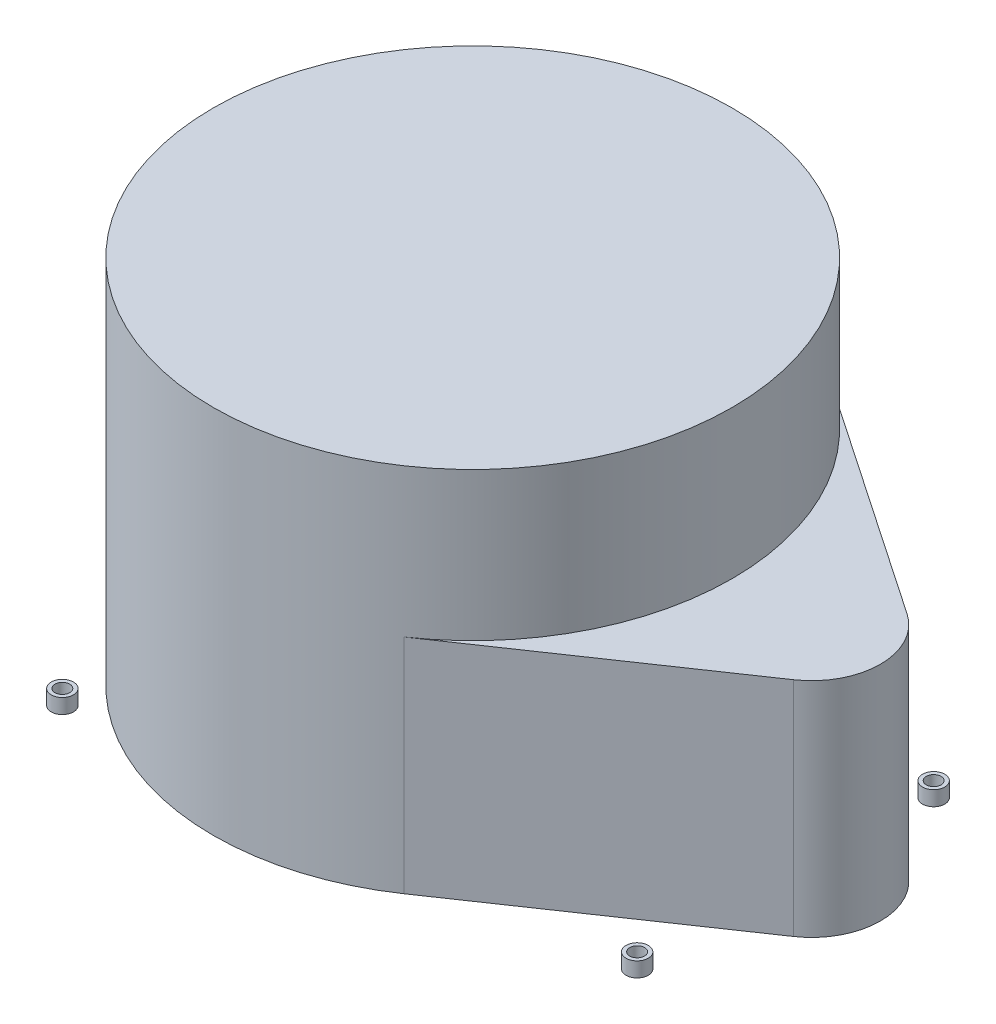
ISO-10303-21;
HEADER;
FILE_DESCRIPTION(('STEP AP214'),'2;1');
FILE_NAME('part.step','',(''),(''),'','','');
FILE_SCHEMA(('AUTOMOTIVE_DESIGN { 1 0 10303 214 1 1 1 1 }'));
ENDSEC;
DATA;
#1=APPLICATION_CONTEXT('core data for automotive mechanical design processes');
#2=APPLICATION_PROTOCOL_DEFINITION('international standard','automotive_design',2000,#1);
#3=PRODUCT_CONTEXT('',#1,'mechanical');
#4=PRODUCT('Part','Part','',(#3));
#5=PRODUCT_RELATED_PRODUCT_CATEGORY('part','',(#4));
#6=PRODUCT_DEFINITION_FORMATION('','',#4);
#7=PRODUCT_DEFINITION_CONTEXT('part definition',#1,'design');
#8=PRODUCT_DEFINITION('design','',#6,#7);
#9=PRODUCT_DEFINITION_SHAPE('','',#8);
#10=(LENGTH_UNIT() NAMED_UNIT(*) SI_UNIT(.MILLI.,.METRE.));
#11=(NAMED_UNIT(*) PLANE_ANGLE_UNIT() SI_UNIT($,.RADIAN.));
#12=(NAMED_UNIT(*) SI_UNIT($,.STERADIAN.) SOLID_ANGLE_UNIT());
#13=UNCERTAINTY_MEASURE_WITH_UNIT(LENGTH_MEASURE(1.E-05),#10,'distance_accuracy_value','');
#14=(GEOMETRIC_REPRESENTATION_CONTEXT(3) GLOBAL_UNCERTAINTY_ASSIGNED_CONTEXT((#13)) GLOBAL_UNIT_ASSIGNED_CONTEXT((#10,
#11,#12)) REPRESENTATION_CONTEXT('',''));
#15=CARTESIAN_POINT('',(0.,0.,0.));
#16=DIRECTION('',(0.,0.,1.));
#17=DIRECTION('',(1.,0.,0.));
#18=AXIS2_PLACEMENT_3D('',#15,#16,#17);
#19=CARTESIAN_POINT('',(-27.3582013614978,3.,-28.));
#20=DIRECTION('',(0.,-1.,0.));
#21=DIRECTION('',(0.,0.,-1.));
#22=AXIS2_PLACEMENT_3D('',#19,#20,#21);
#23=PLANE('',#22);
#24=CARTESIAN_POINT('',(-27.3582013614978,3.,-28.));
#25=DIRECTION('',(0.,-1.,0.));
#26=DIRECTION('',(0.,0.,-1.));
#27=AXIS2_PLACEMENT_3D('',#24,#25,#26);
#28=CIRCLE('',#27,1.5);
#29=CARTESIAN_POINT('',(-27.3582013614978,3.,-29.5));
#30=VERTEX_POINT('',#29);
#31=EDGE_CURVE('E11',#30,#30,#28,.T.);
#32=ORIENTED_EDGE('',*,*,#31,.T.);
#33=EDGE_LOOP('',(#32));
#34=FACE_BOUND('',#33,.T.);
#35=CARTESIAN_POINT('',(-27.3582013614978,3.,-28.));
#36=DIRECTION('',(0.,-1.,0.));
#37=DIRECTION('',(0.,0.,1.));
#38=AXIS2_PLACEMENT_3D('',#35,#36,#37);
#39=CIRCLE('',#38,1.);
#40=CARTESIAN_POINT('',(-27.3582013614978,3.,-27.));
#41=VERTEX_POINT('',#40);
#42=EDGE_CURVE('E53',#41,#41,#39,.T.);
#43=ORIENTED_EDGE('',*,*,#42,.F.);
#44=EDGE_LOOP('',(#43));
#45=FACE_BOUND('',#44,.T.);
#46=ADVANCED_FACE('F42',(#34,#45),#23,.T.);
#47=CARTESIAN_POINT('',(-27.3582013614978,5.,-28.));
#48=DIRECTION('',(0.,-1.,0.));
#49=DIRECTION('',(0.,0.,-1.));
#50=AXIS2_PLACEMENT_3D('',#47,#48,#49);
#51=PLANE('',#50);
#52=CARTESIAN_POINT('',(-27.3582013614978,5.,-28.));
#53=DIRECTION('',(0.,-1.,0.));
#54=DIRECTION('',(0.,0.,-1.));
#55=AXIS2_PLACEMENT_3D('',#52,#53,#54);
#56=CIRCLE('',#55,1.5);
#57=CARTESIAN_POINT('',(-27.3582013614978,5.,-29.5));
#58=VERTEX_POINT('',#57);
#59=EDGE_CURVE('E46',#58,#58,#56,.T.);
#60=ORIENTED_EDGE('',*,*,#59,.F.);
#61=EDGE_LOOP('',(#60));
#62=FACE_BOUND('',#61,.T.);
#63=CARTESIAN_POINT('',(-27.3582013614978,5.,-28.));
#64=DIRECTION('',(0.,-1.,0.));
#65=DIRECTION('',(0.,0.,1.));
#66=AXIS2_PLACEMENT_3D('',#63,#64,#65);
#67=CIRCLE('',#66,1.);
#68=CARTESIAN_POINT('',(-27.3582013614978,5.,-27.));
#69=VERTEX_POINT('',#68);
#70=EDGE_CURVE('E55',#69,#69,#67,.T.);
#71=ORIENTED_EDGE('',*,*,#70,.T.);
#72=EDGE_LOOP('',(#71));
#73=FACE_BOUND('',#72,.T.);
#74=ADVANCED_FACE('F65',(#62,#73),#51,.F.);
#75=CARTESIAN_POINT('',(-27.3582013614978,3.,-28.));
#76=DIRECTION('',(0.,1.,0.));
#77=DIRECTION('',(0.,0.,1.));
#78=AXIS2_PLACEMENT_3D('',#75,#76,#77);
#79=CYLINDRICAL_SURFACE('',#78,1.5);
#80=ORIENTED_EDGE('',*,*,#31,.F.);
#81=EDGE_LOOP('',(#80));
#82=FACE_BOUND('',#81,.T.);
#83=ORIENTED_EDGE('',*,*,#59,.T.);
#84=EDGE_LOOP('',(#83));
#85=FACE_BOUND('',#84,.T.);
#86=ADVANCED_FACE('F44',(#82,#85),#79,.T.);
#87=CARTESIAN_POINT('',(-27.3582013614978,3.,-28.));
#88=DIRECTION('',(0.,1.,0.));
#89=DIRECTION('',(0.,0.,1.));
#90=AXIS2_PLACEMENT_3D('',#87,#88,#89);
#91=CYLINDRICAL_SURFACE('',#90,1.);
#92=ORIENTED_EDGE('',*,*,#42,.T.);
#93=EDGE_LOOP('',(#92));
#94=FACE_BOUND('',#93,.T.);
#95=ORIENTED_EDGE('',*,*,#70,.F.);
#96=EDGE_LOOP('',(#95));
#97=FACE_BOUND('',#96,.T.);
#98=ADVANCED_FACE('F61',(#94,#97),#91,.F.);
#99=CLOSED_SHELL('',(#46,#74,#86,#98));
#100=MANIFOLD_SOLID_BREP('B2',#99);
#101=CARTESIAN_POINT('',(42.183153241357,3.,-20.));
#102=DIRECTION('',(0.,1.,0.));
#103=DIRECTION('',(0.,0.,1.));
#104=AXIS2_PLACEMENT_3D('',#101,#102,#103);
#105=PLANE('',#104);
#106=CARTESIAN_POINT('',(42.183153241357,3.,-20.));
#107=DIRECTION('',(0.,-1.,0.));
#108=DIRECTION('',(0.,0.,1.));
#109=AXIS2_PLACEMENT_3D('',#106,#107,#108);
#110=CIRCLE('',#109,1.5);
#111=CARTESIAN_POINT('',(42.183153241357,3.,-18.5));
#112=VERTEX_POINT('',#111);
#113=EDGE_CURVE('E41',#112,#112,#110,.T.);
#114=ORIENTED_EDGE('',*,*,#113,.T.);
#115=EDGE_LOOP('',(#114));
#116=FACE_BOUND('',#115,.T.);
#117=CARTESIAN_POINT('',(42.183153241357,3.,-20.));
#118=DIRECTION('',(0.,-1.,0.));
#119=DIRECTION('',(0.,0.,1.));
#120=AXIS2_PLACEMENT_3D('',#117,#118,#119);
#121=CIRCLE('',#120,0.999999999999998);
#122=CARTESIAN_POINT('',(42.183153241357,3.,-19.));
#123=VERTEX_POINT('',#122);
#124=EDGE_CURVE('E123',#123,#123,#121,.T.);
#125=ORIENTED_EDGE('',*,*,#124,.F.);
#126=EDGE_LOOP('',(#125));
#127=FACE_BOUND('',#126,.T.);
#128=ADVANCED_FACE('F112',(#116,#127),#105,.F.);
#129=CARTESIAN_POINT('',(42.183153241357,5.,-20.));
#130=DIRECTION('',(0.,1.,0.));
#131=DIRECTION('',(0.,0.,1.));
#132=AXIS2_PLACEMENT_3D('',#129,#130,#131);
#133=PLANE('',#132);
#134=CARTESIAN_POINT('',(42.183153241357,5.,-20.));
#135=DIRECTION('',(0.,-1.,0.));
#136=DIRECTION('',(0.,0.,1.));
#137=AXIS2_PLACEMENT_3D('',#134,#135,#136);
#138=CIRCLE('',#137,1.5);
#139=CARTESIAN_POINT('',(42.183153241357,5.,-18.5));
#140=VERTEX_POINT('',#139);
#141=EDGE_CURVE('E116',#140,#140,#138,.T.);
#142=ORIENTED_EDGE('',*,*,#141,.F.);
#143=EDGE_LOOP('',(#142));
#144=FACE_BOUND('',#143,.T.);
#145=CARTESIAN_POINT('',(42.183153241357,5.,-20.));
#146=DIRECTION('',(0.,-1.,0.));
#147=DIRECTION('',(0.,0.,1.));
#148=AXIS2_PLACEMENT_3D('',#145,#146,#147);
#149=CIRCLE('',#148,0.999999999999998);
#150=CARTESIAN_POINT('',(42.183153241357,5.,-19.));
#151=VERTEX_POINT('',#150);
#152=EDGE_CURVE('E125',#151,#151,#149,.T.);
#153=ORIENTED_EDGE('',*,*,#152,.T.);
#154=EDGE_LOOP('',(#153));
#155=FACE_BOUND('',#154,.T.);
#156=ADVANCED_FACE('F135',(#144,#155),#133,.T.);
#157=CARTESIAN_POINT('',(42.183153241357,3.,-20.));
#158=DIRECTION('',(0.,1.,0.));
#159=DIRECTION('',(0.,0.,1.));
#160=AXIS2_PLACEMENT_3D('',#157,#158,#159);
#161=CYLINDRICAL_SURFACE('',#160,1.5);
#162=ORIENTED_EDGE('',*,*,#113,.F.);
#163=EDGE_LOOP('',(#162));
#164=FACE_BOUND('',#163,.T.);
#165=ORIENTED_EDGE('',*,*,#141,.T.);
#166=EDGE_LOOP('',(#165));
#167=FACE_BOUND('',#166,.T.);
#168=ADVANCED_FACE('F114',(#164,#167),#161,.T.);
#169=CARTESIAN_POINT('',(42.183153241357,3.,-20.));
#170=DIRECTION('',(0.,1.,0.));
#171=DIRECTION('',(0.,0.,1.));
#172=AXIS2_PLACEMENT_3D('',#169,#170,#171);
#173=CYLINDRICAL_SURFACE('',#172,0.999999999999998);
#174=ORIENTED_EDGE('',*,*,#124,.T.);
#175=EDGE_LOOP('',(#174));
#176=FACE_BOUND('',#175,.T.);
#177=ORIENTED_EDGE('',*,*,#152,.F.);
#178=EDGE_LOOP('',(#177));
#179=FACE_BOUND('',#178,.T.);
#180=ADVANCED_FACE('F131',(#176,#179),#173,.F.);
#181=CLOSED_SHELL('',(#128,#156,#168,#180));
#182=MANIFOLD_SOLID_BREP('B6',#181);
#183=CARTESIAN_POINT('',(-27.3582013614978,3.,28.));
#184=DIRECTION('',(0.,-1.,0.));
#185=DIRECTION('',(0.,0.,-1.));
#186=AXIS2_PLACEMENT_3D('',#183,#184,#185);
#187=PLANE('',#186);
#188=CARTESIAN_POINT('',(-27.3582013614978,3.,28.));
#189=DIRECTION('',(0.,-1.,0.));
#190=DIRECTION('',(0.,0.,-1.));
#191=AXIS2_PLACEMENT_3D('',#188,#189,#190);
#192=CIRCLE('',#191,1.5);
#193=CARTESIAN_POINT('',(-27.3582013614978,3.,26.5));
#194=VERTEX_POINT('',#193);
#195=EDGE_CURVE('E111',#194,#194,#192,.T.);
#196=ORIENTED_EDGE('',*,*,#195,.T.);
#197=EDGE_LOOP('',(#196));
#198=FACE_BOUND('',#197,.T.);
#199=CARTESIAN_POINT('',(-27.3582013614978,3.,28.));
#200=DIRECTION('',(0.,-1.,0.));
#201=DIRECTION('',(0.,0.,-1.));
#202=AXIS2_PLACEMENT_3D('',#199,#200,#201);
#203=CIRCLE('',#202,1.);
#204=CARTESIAN_POINT('',(-27.3582013614978,3.,27.));
#205=VERTEX_POINT('',#204);
#206=EDGE_CURVE('E193',#205,#205,#203,.T.);
#207=ORIENTED_EDGE('',*,*,#206,.F.);
#208=EDGE_LOOP('',(#207));
#209=FACE_BOUND('',#208,.T.);
#210=ADVANCED_FACE('F182',(#198,#209),#187,.T.);
#211=CARTESIAN_POINT('',(-27.3582013614978,5.,28.));
#212=DIRECTION('',(0.,-1.,0.));
#213=DIRECTION('',(0.,0.,-1.));
#214=AXIS2_PLACEMENT_3D('',#211,#212,#213);
#215=PLANE('',#214);
#216=CARTESIAN_POINT('',(-27.3582013614978,5.,28.));
#217=DIRECTION('',(0.,-1.,0.));
#218=DIRECTION('',(0.,0.,-1.));
#219=AXIS2_PLACEMENT_3D('',#216,#217,#218);
#220=CIRCLE('',#219,1.5);
#221=CARTESIAN_POINT('',(-27.3582013614978,5.,26.5));
#222=VERTEX_POINT('',#221);
#223=EDGE_CURVE('E186',#222,#222,#220,.T.);
#224=ORIENTED_EDGE('',*,*,#223,.F.);
#225=EDGE_LOOP('',(#224));
#226=FACE_BOUND('',#225,.T.);
#227=CARTESIAN_POINT('',(-27.3582013614978,5.,28.));
#228=DIRECTION('',(0.,-1.,0.));
#229=DIRECTION('',(0.,0.,-1.));
#230=AXIS2_PLACEMENT_3D('',#227,#228,#229);
#231=CIRCLE('',#230,1.);
#232=CARTESIAN_POINT('',(-27.3582013614978,5.,27.));
#233=VERTEX_POINT('',#232);
#234=EDGE_CURVE('E195',#233,#233,#231,.T.);
#235=ORIENTED_EDGE('',*,*,#234,.T.);
#236=EDGE_LOOP('',(#235));
#237=FACE_BOUND('',#236,.T.);
#238=ADVANCED_FACE('F205',(#226,#237),#215,.F.);
#239=CARTESIAN_POINT('',(-27.3582013614978,3.,28.));
#240=DIRECTION('',(0.,1.,0.));
#241=DIRECTION('',(0.,0.,1.));
#242=AXIS2_PLACEMENT_3D('',#239,#240,#241);
#243=CYLINDRICAL_SURFACE('',#242,1.5);
#244=ORIENTED_EDGE('',*,*,#195,.F.);
#245=EDGE_LOOP('',(#244));
#246=FACE_BOUND('',#245,.T.);
#247=ORIENTED_EDGE('',*,*,#223,.T.);
#248=EDGE_LOOP('',(#247));
#249=FACE_BOUND('',#248,.T.);
#250=ADVANCED_FACE('F184',(#246,#249),#243,.T.);
#251=CARTESIAN_POINT('',(-27.3582013614978,3.,28.));
#252=DIRECTION('',(0.,1.,0.));
#253=DIRECTION('',(0.,0.,1.));
#254=AXIS2_PLACEMENT_3D('',#251,#252,#253);
#255=CYLINDRICAL_SURFACE('',#254,1.);
#256=ORIENTED_EDGE('',*,*,#206,.T.);
#257=EDGE_LOOP('',(#256));
#258=FACE_BOUND('',#257,.T.);
#259=ORIENTED_EDGE('',*,*,#234,.F.);
#260=EDGE_LOOP('',(#259));
#261=FACE_BOUND('',#260,.T.);
#262=ADVANCED_FACE('F201',(#258,#261),#255,.F.);
#263=CLOSED_SHELL('',(#210,#238,#250,#262));
#264=MANIFOLD_SOLID_BREP('B36',#263);
#265=CARTESIAN_POINT('',(42.183153241357,3.,20.));
#266=DIRECTION('',(0.,-1.,0.));
#267=DIRECTION('',(0.,0.,-1.));
#268=AXIS2_PLACEMENT_3D('',#265,#266,#267);
#269=PLANE('',#268);
#270=CARTESIAN_POINT('',(42.183153241357,3.,20.));
#271=DIRECTION('',(0.,-1.,0.));
#272=DIRECTION('',(0.,0.,-1.));
#273=AXIS2_PLACEMENT_3D('',#270,#271,#272);
#274=CIRCLE('',#273,1.5);
#275=CARTESIAN_POINT('',(42.183153241357,3.,18.5));
#276=VERTEX_POINT('',#275);
#277=EDGE_CURVE('E181',#276,#276,#274,.T.);
#278=ORIENTED_EDGE('',*,*,#277,.T.);
#279=EDGE_LOOP('',(#278));
#280=FACE_BOUND('',#279,.T.);
#281=CARTESIAN_POINT('',(42.183153241357,3.,20.));
#282=DIRECTION('',(0.,-1.,0.));
#283=DIRECTION('',(0.,0.,-1.));
#284=AXIS2_PLACEMENT_3D('',#281,#282,#283);
#285=CIRCLE('',#284,0.999999999999998);
#286=CARTESIAN_POINT('',(42.183153241357,3.,19.));
#287=VERTEX_POINT('',#286);
#288=EDGE_CURVE('E264',#287,#287,#285,.T.);
#289=ORIENTED_EDGE('',*,*,#288,.F.);
#290=EDGE_LOOP('',(#289));
#291=FACE_BOUND('',#290,.T.);
#292=ADVANCED_FACE('F253',(#280,#291),#269,.T.);
#293=CARTESIAN_POINT('',(42.183153241357,5.,20.));
#294=DIRECTION('',(0.,-1.,0.));
#295=DIRECTION('',(0.,0.,-1.));
#296=AXIS2_PLACEMENT_3D('',#293,#294,#295);
#297=PLANE('',#296);
#298=CARTESIAN_POINT('',(42.183153241357,5.,20.));
#299=DIRECTION('',(0.,-1.,0.));
#300=DIRECTION('',(0.,0.,-1.));
#301=AXIS2_PLACEMENT_3D('',#298,#299,#300);
#302=CIRCLE('',#301,1.5);
#303=CARTESIAN_POINT('',(42.183153241357,5.,18.5));
#304=VERTEX_POINT('',#303);
#305=EDGE_CURVE('E257',#304,#304,#302,.T.);
#306=ORIENTED_EDGE('',*,*,#305,.F.);
#307=EDGE_LOOP('',(#306));
#308=FACE_BOUND('',#307,.T.);
#309=CARTESIAN_POINT('',(42.183153241357,5.,20.));
#310=DIRECTION('',(0.,-1.,0.));
#311=DIRECTION('',(0.,0.,-1.));
#312=AXIS2_PLACEMENT_3D('',#309,#310,#311);
#313=CIRCLE('',#312,0.999999999999998);
#314=CARTESIAN_POINT('',(42.183153241357,5.,19.));
#315=VERTEX_POINT('',#314);
#316=EDGE_CURVE('E266',#315,#315,#313,.T.);
#317=ORIENTED_EDGE('',*,*,#316,.T.);
#318=EDGE_LOOP('',(#317));
#319=FACE_BOUND('',#318,.T.);
#320=ADVANCED_FACE('F276',(#308,#319),#297,.F.);
#321=CARTESIAN_POINT('',(42.183153241357,3.,20.));
#322=DIRECTION('',(0.,1.,0.));
#323=DIRECTION('',(0.,0.,1.));
#324=AXIS2_PLACEMENT_3D('',#321,#322,#323);
#325=CYLINDRICAL_SURFACE('',#324,1.5);
#326=ORIENTED_EDGE('',*,*,#277,.F.);
#327=EDGE_LOOP('',(#326));
#328=FACE_BOUND('',#327,.T.);
#329=ORIENTED_EDGE('',*,*,#305,.T.);
#330=EDGE_LOOP('',(#329));
#331=FACE_BOUND('',#330,.T.);
#332=ADVANCED_FACE('F255',(#328,#331),#325,.T.);
#333=CARTESIAN_POINT('',(42.183153241357,3.,20.));
#334=DIRECTION('',(0.,1.,0.));
#335=DIRECTION('',(0.,0.,1.));
#336=AXIS2_PLACEMENT_3D('',#333,#334,#335);
#337=CYLINDRICAL_SURFACE('',#336,0.999999999999998);
#338=ORIENTED_EDGE('',*,*,#288,.T.);
#339=EDGE_LOOP('',(#338));
#340=FACE_BOUND('',#339,.T.);
#341=ORIENTED_EDGE('',*,*,#316,.F.);
#342=EDGE_LOOP('',(#341));
#343=FACE_BOUND('',#342,.T.);
#344=ADVANCED_FACE('F272',(#340,#343),#337,.F.);
#345=CLOSED_SHELL('',(#292,#320,#332,#344));
#346=MANIFOLD_SOLID_BREP('B106',#345);
#347=CARTESIAN_POINT('',(0.,35.,0.));
#348=DIRECTION('',(0.,-1.,0.));
#349=DIRECTION('',(0.,0.,-1.));
#350=AXIS2_PLACEMENT_3D('',#347,#348,#349);
#351=CYLINDRICAL_SURFACE('',#350,35.);
#352=CARTESIAN_POINT('',(0.,5.,0.));
#353=DIRECTION('',(0.,1.,0.));
#354=DIRECTION('',(0.,0.,1.));
#355=AXIS2_PLACEMENT_3D('',#352,#353,#354);
#356=CIRCLE('',#355,35.);
#357=CARTESIAN_POINT('',(19.693574926227,5.,-28.9337710405174));
#358=VERTEX_POINT('',#357);
#359=CARTESIAN_POINT('',(19.693574926227,5.,28.9337710405174));
#360=VERTEX_POINT('',#359);
#361=EDGE_CURVE('E368',#358,#360,#356,.T.);
#362=ORIENTED_EDGE('',*,*,#361,.T.);
#363=DIRECTION('',(0.,-1.,0.));
#364=VECTOR('',#363,1.);
#365=CARTESIAN_POINT('',(19.693574926227,35.,28.9337710405174));
#366=LINE('',#365,#364);
#367=CARTESIAN_POINT('',(19.693574926227,35.,28.9337710405174));
#368=VERTEX_POINT('',#367);
#369=EDGE_CURVE('E251',#368,#360,#366,.T.);
#370=ORIENTED_EDGE('',*,*,#369,.F.);
#371=CARTESIAN_POINT('',(0.,35.,0.));
#372=DIRECTION('',(0.,1.,0.));
#373=DIRECTION('',(0.,0.,1.));
#374=AXIS2_PLACEMENT_3D('',#371,#372,#373);
#375=CIRCLE('',#374,35.);
#376=CARTESIAN_POINT('',(19.693574926227,35.,-28.9337710405174));
#377=VERTEX_POINT('',#376);
#378=EDGE_CURVE('E366',#368,#377,#375,.T.);
#379=ORIENTED_EDGE('',*,*,#378,.T.);
#380=DIRECTION('',(0.,-1.,0.));
#381=VECTOR('',#380,1.);
#382=CARTESIAN_POINT('',(19.693574926227,35.,-28.9337710405174));
#383=LINE('',#382,#381);
#384=EDGE_CURVE('E382',#377,#358,#383,.T.);
#385=ORIENTED_EDGE('',*,*,#384,.T.);
#386=EDGE_LOOP('',(#362,#370,#379,#385));
#387=FACE_BOUND('',#386,.T.);
#388=CARTESIAN_POINT('',(0.,55.,0.));
#389=DIRECTION('',(0.,1.,0.));
#390=DIRECTION('',(0.,0.,1.));
#391=AXIS2_PLACEMENT_3D('',#388,#389,#390);
#392=CIRCLE('',#391,35.);
#393=CARTESIAN_POINT('',(0.,55.,35.));
#394=VERTEX_POINT('',#393);
#395=EDGE_CURVE('E375',#394,#394,#392,.T.);
#396=ORIENTED_EDGE('',*,*,#395,.F.);
#397=EDGE_LOOP('',(#396));
#398=FACE_BOUND('',#397,.T.);
#399=ADVANCED_FACE('F315',(#387,#398),#351,.T.);
#400=CARTESIAN_POINT('',(50.9470463126424,35.,7.66130781437387));
#401=DIRECTION('',(-0.562673569320771,0.,-0.826679172586211));
#402=DIRECTION('',(-0.826679172586211,0.,0.562673569320771));
#403=AXIS2_PLACEMENT_3D('',#400,#401,#402);
#404=PLANE('',#403);
#405=DIRECTION('',(0.826679172586211,0.,-0.562673569320771));
#406=VECTOR('',#405,1.);
#407=CARTESIAN_POINT('',(50.9470463126424,5.,7.66130781437387));
#408=LINE('',#407,#406);
#409=CARTESIAN_POINT('',(50.9470463126424,5.,7.66130781437387));
#410=VERTEX_POINT('',#409);
#411=EDGE_CURVE('E384',#360,#410,#408,.T.);
#412=ORIENTED_EDGE('',*,*,#411,.T.);
#413=DIRECTION('',(0.,-1.,0.));
#414=VECTOR('',#413,1.);
#415=CARTESIAN_POINT('',(50.9470463126424,35.,7.66130781437387));
#416=LINE('',#415,#414);
#417=CARTESIAN_POINT('',(50.9470463126424,35.,7.66130781437387));
#418=VERTEX_POINT('',#417);
#419=EDGE_CURVE('E323',#418,#410,#416,.T.);
#420=ORIENTED_EDGE('',*,*,#419,.F.);
#421=DIRECTION('',(0.826679172586211,0.,-0.562673569320771));
#422=VECTOR('',#421,1.);
#423=CARTESIAN_POINT('',(50.9470463126424,35.,7.66130781437387));
#424=LINE('',#423,#422);
#425=EDGE_CURVE('E358',#368,#418,#424,.T.);
#426=ORIENTED_EDGE('',*,*,#425,.F.);
#427=ORIENTED_EDGE('',*,*,#369,.T.);
#428=EDGE_LOOP('',(#412,#420,#426,#427));
#429=FACE_BOUND('',#428,.T.);
#430=ADVANCED_FACE('F370',(#429),#404,.F.);
#431=CARTESIAN_POINT('',(45.7324291352279,35.,0.));
#432=DIRECTION('',(0.,-1.,0.));
#433=DIRECTION('',(0.,0.,-1.));
#434=AXIS2_PLACEMENT_3D('',#431,#432,#433);
#435=CYLINDRICAL_SURFACE('',#434,9.26757086477209);
#436=CARTESIAN_POINT('',(45.7324291352279,5.,0.));
#437=DIRECTION('',(0.,1.,0.));
#438=DIRECTION('',(0.,0.,1.));
#439=AXIS2_PLACEMENT_3D('',#436,#437,#438);
#440=CIRCLE('',#439,9.26757086477209);
#441=CARTESIAN_POINT('',(50.9470463126424,5.,-7.66130781437387));
#442=VERTEX_POINT('',#441);
#443=EDGE_CURVE('E349',#410,#442,#440,.T.);
#444=ORIENTED_EDGE('',*,*,#443,.T.);
#445=DIRECTION('',(0.,-1.,0.));
#446=VECTOR('',#445,1.);
#447=CARTESIAN_POINT('',(50.9470463126424,35.,-7.66130781437387));
#448=LINE('',#447,#446);
#449=CARTESIAN_POINT('',(50.9470463126424,35.,-7.66130781437387));
#450=VERTEX_POINT('',#449);
#451=EDGE_CURVE('E389',#450,#442,#448,.T.);
#452=ORIENTED_EDGE('',*,*,#451,.F.);
#453=CARTESIAN_POINT('',(45.7324291352279,35.,0.));
#454=DIRECTION('',(0.,1.,0.));
#455=DIRECTION('',(0.,0.,1.));
#456=AXIS2_PLACEMENT_3D('',#453,#454,#455);
#457=CIRCLE('',#456,9.26757086477209);
#458=EDGE_CURVE('E372',#418,#450,#457,.T.);
#459=ORIENTED_EDGE('',*,*,#458,.F.);
#460=ORIENTED_EDGE('',*,*,#419,.T.);
#461=EDGE_LOOP('',(#444,#452,#459,#460));
#462=FACE_BOUND('',#461,.T.);
#463=ADVANCED_FACE('F390',(#462),#435,.T.);
#464=CARTESIAN_POINT('',(19.693574926227,35.,-28.9337710405174));
#465=DIRECTION('',(-0.562673569320771,0.,0.826679172586211));
#466=DIRECTION('',(0.826679172586211,0.,0.562673569320771));
#467=AXIS2_PLACEMENT_3D('',#464,#465,#466);
#468=PLANE('',#467);
#469=DIRECTION('',(-0.826679172586212,0.,-0.562673569320771));
#470=VECTOR('',#469,1.);
#471=CARTESIAN_POINT('',(19.693574926227,5.,-28.9337710405174));
#472=LINE('',#471,#470);
#473=EDGE_CURVE('E354',#442,#358,#472,.T.);
#474=ORIENTED_EDGE('',*,*,#473,.T.);
#475=ORIENTED_EDGE('',*,*,#384,.F.);
#476=DIRECTION('',(-0.826679172586212,0.,-0.562673569320771));
#477=VECTOR('',#476,1.);
#478=CARTESIAN_POINT('',(19.693574926227,35.,-28.9337710405174));
#479=LINE('',#478,#477);
#480=EDGE_CURVE('E331',#450,#377,#479,.T.);
#481=ORIENTED_EDGE('',*,*,#480,.F.);
#482=ORIENTED_EDGE('',*,*,#451,.T.);
#483=EDGE_LOOP('',(#474,#475,#481,#482));
#484=FACE_BOUND('',#483,.T.);
#485=ADVANCED_FACE('F402',(#484),#468,.F.);
#486=CARTESIAN_POINT('',(0.,35.,0.));
#487=DIRECTION('',(0.,1.,0.));
#488=DIRECTION('',(0.,0.,1.));
#489=AXIS2_PLACEMENT_3D('',#486,#487,#488);
#490=PLANE('',#489);
#491=ORIENTED_EDGE('',*,*,#378,.F.);
#492=ORIENTED_EDGE('',*,*,#425,.T.);
#493=ORIENTED_EDGE('',*,*,#458,.T.);
#494=ORIENTED_EDGE('',*,*,#480,.T.);
#495=EDGE_LOOP('',(#491,#492,#493,#494));
#496=FACE_BOUND('',#495,.T.);
#497=ADVANCED_FACE('F374',(#496),#490,.T.);
#498=CARTESIAN_POINT('',(0.,5.,0.));
#499=DIRECTION('',(0.,1.,0.));
#500=DIRECTION('',(0.,0.,1.));
#501=AXIS2_PLACEMENT_3D('',#498,#499,#500);
#502=PLANE('',#501);
#503=ORIENTED_EDGE('',*,*,#361,.F.);
#504=ORIENTED_EDGE('',*,*,#473,.F.);
#505=ORIENTED_EDGE('',*,*,#443,.F.);
#506=ORIENTED_EDGE('',*,*,#411,.F.);
#507=EDGE_LOOP('',(#503,#504,#505,#506));
#508=FACE_BOUND('',#507,.T.);
#509=ADVANCED_FACE('F392',(#508),#502,.F.);
#510=CARTESIAN_POINT('',(0.,55.,0.));
#511=DIRECTION('',(0.,1.,0.));
#512=DIRECTION('',(0.,0.,1.));
#513=AXIS2_PLACEMENT_3D('',#510,#511,#512);
#514=PLANE('',#513);
#515=ORIENTED_EDGE('',*,*,#395,.T.);
#516=EDGE_LOOP('',(#515));
#517=FACE_BOUND('',#516,.T.);
#518=ADVANCED_FACE('F394',(#517),#514,.T.);
#519=CLOSED_SHELL('',(#399,#430,#463,#485,#497,#509,#518));
#520=MANIFOLD_SOLID_BREP('B176',#519);
#521=ADVANCED_BREP_SHAPE_REPRESENTATION('',(#18,#100,#182,#264,#346,#520),#14);
#522=SHAPE_DEFINITION_REPRESENTATION(#9,#521);
ENDSEC;
END-ISO-10303-21;
